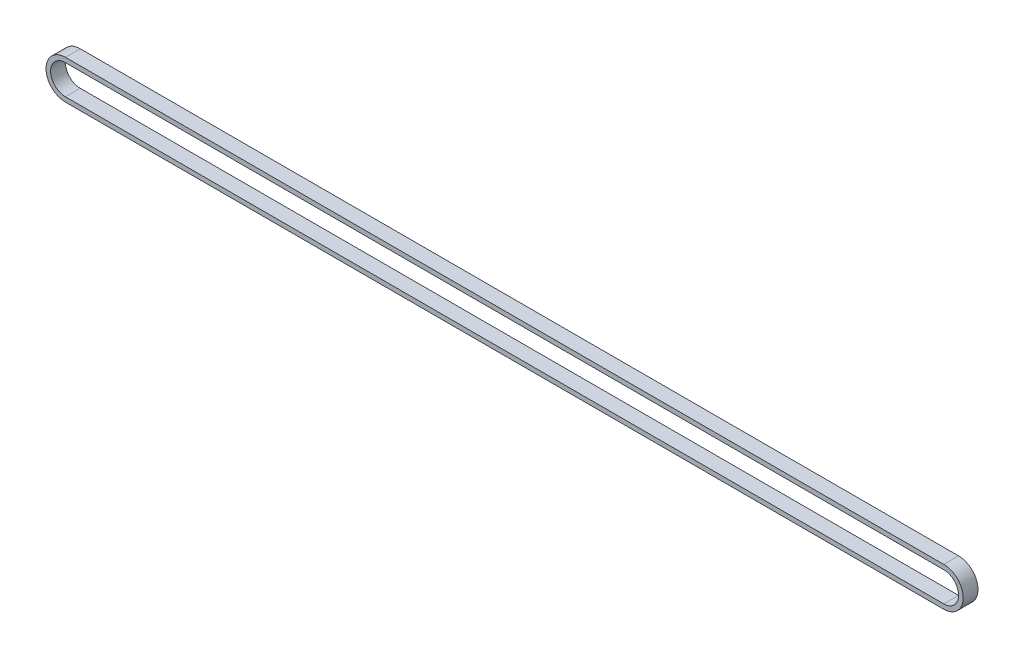
ISO-10303-21;
HEADER;
FILE_DESCRIPTION(('STEP AP214'),'2;1');
FILE_NAME('part.step','',(''),(''),'','','');
FILE_SCHEMA(('AUTOMOTIVE_DESIGN { 1 0 10303 214 1 1 1 1 }'));
ENDSEC;
DATA;
#1=APPLICATION_CONTEXT('core data for automotive mechanical design processes');
#2=APPLICATION_PROTOCOL_DEFINITION('international standard','automotive_design',2000,#1);
#3=PRODUCT_CONTEXT('',#1,'mechanical');
#4=PRODUCT('Part','Part','',(#3));
#5=PRODUCT_RELATED_PRODUCT_CATEGORY('part','',(#4));
#6=PRODUCT_DEFINITION_FORMATION('','',#4);
#7=PRODUCT_DEFINITION_CONTEXT('part definition',#1,'design');
#8=PRODUCT_DEFINITION('design','',#6,#7);
#9=PRODUCT_DEFINITION_SHAPE('','',#8);
#10=(LENGTH_UNIT() NAMED_UNIT(*) SI_UNIT(.MILLI.,.METRE.));
#11=(NAMED_UNIT(*) PLANE_ANGLE_UNIT() SI_UNIT($,.RADIAN.));
#12=(NAMED_UNIT(*) SI_UNIT($,.STERADIAN.) SOLID_ANGLE_UNIT());
#13=UNCERTAINTY_MEASURE_WITH_UNIT(LENGTH_MEASURE(1.E-05),#10,'distance_accuracy_value','');
#14=(GEOMETRIC_REPRESENTATION_CONTEXT(3) GLOBAL_UNCERTAINTY_ASSIGNED_CONTEXT((#13)) GLOBAL_UNIT_ASSIGNED_CONTEXT((#10,
#11,#12)) REPRESENTATION_CONTEXT('',''));
#15=CARTESIAN_POINT('',(0.,0.,0.));
#16=DIRECTION('',(0.,0.,1.));
#17=DIRECTION('',(1.,0.,0.));
#18=AXIS2_PLACEMENT_3D('',#15,#16,#17);
#19=CARTESIAN_POINT('',(950.,0.,8.));
#20=DIRECTION('',(0.,0.,1.));
#21=DIRECTION('',(1.,0.,0.));
#22=AXIS2_PLACEMENT_3D('',#19,#20,#21);
#23=PLANE('',#22);
#24=CARTESIAN_POINT('',(950.,0.,8.));
#25=DIRECTION('',(0.,0.,1.));
#26=DIRECTION('',(1.,0.,0.));
#27=AXIS2_PLACEMENT_3D('',#24,#25,#26);
#28=CIRCLE('',#27,20.9999999999999);
#29=CARTESIAN_POINT('',(950.,-20.9999999999999,8.));
#30=VERTEX_POINT('',#29);
#31=CARTESIAN_POINT('',(950.,20.9999999999999,8.));
#32=VERTEX_POINT('',#31);
#33=EDGE_CURVE('E138',#30,#32,#28,.T.);
#34=ORIENTED_EDGE('',*,*,#33,.T.);
#35=DIRECTION('',(-1.,0.,0.));
#36=VECTOR('',#35,1.);
#37=CARTESIAN_POINT('',(0.,21.,8.));
#38=LINE('',#37,#36);
#39=CARTESIAN_POINT('',(0.,21.,8.));
#40=VERTEX_POINT('',#39);
#41=EDGE_CURVE('E141',#32,#40,#38,.T.);
#42=ORIENTED_EDGE('',*,*,#41,.T.);
#43=CARTESIAN_POINT('',(0.,0.,8.));
#44=DIRECTION('',(0.,0.,1.));
#45=DIRECTION('',(1.,0.,0.));
#46=AXIS2_PLACEMENT_3D('',#43,#44,#45);
#47=CIRCLE('',#46,21.);
#48=CARTESIAN_POINT('',(0.,-21.,8.));
#49=VERTEX_POINT('',#48);
#50=EDGE_CURVE('E144',#40,#49,#47,.T.);
#51=ORIENTED_EDGE('',*,*,#50,.T.);
#52=DIRECTION('',(1.,0.,0.));
#53=VECTOR('',#52,1.);
#54=CARTESIAN_POINT('',(950.,-20.9999999999999,8.));
#55=LINE('',#54,#53);
#56=EDGE_CURVE('E146',#49,#30,#55,.T.);
#57=ORIENTED_EDGE('',*,*,#56,.T.);
#58=EDGE_LOOP('',(#34,#42,#51,#57));
#59=FACE_BOUND('',#58,.T.);
#60=DIRECTION('',(-1.,0.,0.));
#61=VECTOR('',#60,1.);
#62=CARTESIAN_POINT('',(0.,16.,8.));
#63=LINE('',#62,#61);
#64=CARTESIAN_POINT('',(950.,15.9999999999999,8.));
#65=VERTEX_POINT('',#64);
#66=CARTESIAN_POINT('',(0.,16.,8.));
#67=VERTEX_POINT('',#66);
#68=EDGE_CURVE('E110',#65,#67,#63,.T.);
#69=ORIENTED_EDGE('',*,*,#68,.F.);
#70=CARTESIAN_POINT('',(950.,0.,8.));
#71=DIRECTION('',(0.,0.,1.));
#72=DIRECTION('',(1.,0.,0.));
#73=AXIS2_PLACEMENT_3D('',#70,#71,#72);
#74=CIRCLE('',#73,15.9999999999999);
#75=CARTESIAN_POINT('',(950.,-15.9999999999999,8.));
#76=VERTEX_POINT('',#75);
#77=EDGE_CURVE('E102',#76,#65,#74,.T.);
#78=ORIENTED_EDGE('',*,*,#77,.F.);
#79=DIRECTION('',(1.,0.,0.));
#80=VECTOR('',#79,1.);
#81=CARTESIAN_POINT('',(950.,-15.9999999999999,8.));
#82=LINE('',#81,#80);
#83=CARTESIAN_POINT('',(0.,-16.,8.));
#84=VERTEX_POINT('',#83);
#85=EDGE_CURVE('E124',#84,#76,#82,.T.);
#86=ORIENTED_EDGE('',*,*,#85,.F.);
#87=CARTESIAN_POINT('',(0.,0.,8.));
#88=DIRECTION('',(0.,0.,1.));
#89=DIRECTION('',(1.,0.,0.));
#90=AXIS2_PLACEMENT_3D('',#87,#88,#89);
#91=CIRCLE('',#90,16.);
#92=EDGE_CURVE('E122',#67,#84,#91,.T.);
#93=ORIENTED_EDGE('',*,*,#92,.F.);
#94=EDGE_LOOP('',(#69,#78,#86,#93));
#95=FACE_BOUND('',#94,.T.);
#96=ADVANCED_FACE('F37',(#59,#95),#23,.T.);
#97=CARTESIAN_POINT('',(950.,0.,-8.));
#98=DIRECTION('',(0.,0.,1.));
#99=DIRECTION('',(1.,0.,0.));
#100=AXIS2_PLACEMENT_3D('',#97,#98,#99);
#101=PLANE('',#100);
#102=CARTESIAN_POINT('',(950.,0.,-8.));
#103=DIRECTION('',(0.,0.,1.));
#104=DIRECTION('',(1.,0.,0.));
#105=AXIS2_PLACEMENT_3D('',#102,#103,#104);
#106=CIRCLE('',#105,20.9999999999999);
#107=CARTESIAN_POINT('',(950.,-20.9999999999999,-8.));
#108=VERTEX_POINT('',#107);
#109=CARTESIAN_POINT('',(950.,20.9999999999999,-8.));
#110=VERTEX_POINT('',#109);
#111=EDGE_CURVE('E118',#108,#110,#106,.T.);
#112=ORIENTED_EDGE('',*,*,#111,.F.);
#113=DIRECTION('',(1.,0.,0.));
#114=VECTOR('',#113,1.);
#115=CARTESIAN_POINT('',(950.,-20.9999999999999,-8.));
#116=LINE('',#115,#114);
#117=CARTESIAN_POINT('',(0.,-21.,-8.));
#118=VERTEX_POINT('',#117);
#119=EDGE_CURVE('E142',#118,#108,#116,.T.);
#120=ORIENTED_EDGE('',*,*,#119,.F.);
#121=CARTESIAN_POINT('',(0.,0.,-8.));
#122=DIRECTION('',(0.,0.,1.));
#123=DIRECTION('',(1.,0.,0.));
#124=AXIS2_PLACEMENT_3D('',#121,#122,#123);
#125=CIRCLE('',#124,21.);
#126=CARTESIAN_POINT('',(0.,21.,-8.));
#127=VERTEX_POINT('',#126);
#128=EDGE_CURVE('E153',#127,#118,#125,.T.);
#129=ORIENTED_EDGE('',*,*,#128,.F.);
#130=DIRECTION('',(-1.,0.,0.));
#131=VECTOR('',#130,1.);
#132=CARTESIAN_POINT('',(0.,21.,-8.));
#133=LINE('',#132,#131);
#134=EDGE_CURVE('E151',#110,#127,#133,.T.);
#135=ORIENTED_EDGE('',*,*,#134,.F.);
#136=EDGE_LOOP('',(#112,#120,#129,#135));
#137=FACE_BOUND('',#136,.T.);
#138=CARTESIAN_POINT('',(950.,0.,-8.));
#139=DIRECTION('',(0.,0.,1.));
#140=DIRECTION('',(1.,0.,0.));
#141=AXIS2_PLACEMENT_3D('',#138,#139,#140);
#142=CIRCLE('',#141,15.9999999999999);
#143=CARTESIAN_POINT('',(950.,-15.9999999999999,-8.));
#144=VERTEX_POINT('',#143);
#145=CARTESIAN_POINT('',(950.,15.9999999999999,-8.));
#146=VERTEX_POINT('',#145);
#147=EDGE_CURVE('E60',#144,#146,#142,.T.);
#148=ORIENTED_EDGE('',*,*,#147,.T.);
#149=DIRECTION('',(-1.,0.,0.));
#150=VECTOR('',#149,1.);
#151=CARTESIAN_POINT('',(0.,16.,-8.));
#152=LINE('',#151,#150);
#153=CARTESIAN_POINT('',(0.,16.,-8.));
#154=VERTEX_POINT('',#153);
#155=EDGE_CURVE('E117',#146,#154,#152,.T.);
#156=ORIENTED_EDGE('',*,*,#155,.T.);
#157=CARTESIAN_POINT('',(0.,0.,-8.));
#158=DIRECTION('',(0.,0.,1.));
#159=DIRECTION('',(1.,0.,0.));
#160=AXIS2_PLACEMENT_3D('',#157,#158,#159);
#161=CIRCLE('',#160,16.);
#162=CARTESIAN_POINT('',(0.,-16.,-8.));
#163=VERTEX_POINT('',#162);
#164=EDGE_CURVE('E130',#154,#163,#161,.T.);
#165=ORIENTED_EDGE('',*,*,#164,.T.);
#166=DIRECTION('',(1.,0.,0.));
#167=VECTOR('',#166,1.);
#168=CARTESIAN_POINT('',(950.,-15.9999999999999,-8.));
#169=LINE('',#168,#167);
#170=EDGE_CURVE('E111',#163,#144,#169,.T.);
#171=ORIENTED_EDGE('',*,*,#170,.T.);
#172=EDGE_LOOP('',(#148,#156,#165,#171));
#173=FACE_BOUND('',#172,.T.);
#174=ADVANCED_FACE('F171',(#137,#173),#101,.F.);
#175=CARTESIAN_POINT('',(950.,0.,8.));
#176=DIRECTION('',(0.,0.,-1.));
#177=DIRECTION('',(-1.,0.,0.));
#178=AXIS2_PLACEMENT_3D('',#175,#176,#177);
#179=CYLINDRICAL_SURFACE('',#178,20.9999999999999);
#180=ORIENTED_EDGE('',*,*,#111,.T.);
#181=DIRECTION('',(0.,0.,-1.));
#182=VECTOR('',#181,1.);
#183=CARTESIAN_POINT('',(950.,20.9999999999999,8.));
#184=LINE('',#183,#182);
#185=EDGE_CURVE('E11',#32,#110,#184,.T.);
#186=ORIENTED_EDGE('',*,*,#185,.F.);
#187=ORIENTED_EDGE('',*,*,#33,.F.);
#188=DIRECTION('',(0.,0.,-1.));
#189=VECTOR('',#188,1.);
#190=CARTESIAN_POINT('',(950.,-20.9999999999999,8.));
#191=LINE('',#190,#189);
#192=EDGE_CURVE('E148',#30,#108,#191,.T.);
#193=ORIENTED_EDGE('',*,*,#192,.T.);
#194=EDGE_LOOP('',(#180,#186,#187,#193));
#195=FACE_BOUND('',#194,.T.);
#196=ADVANCED_FACE('F39',(#195),#179,.T.);
#197=CARTESIAN_POINT('',(0.,21.,8.));
#198=DIRECTION('',(0.,-1.,0.));
#199=DIRECTION('',(1.,0.,0.));
#200=AXIS2_PLACEMENT_3D('',#197,#198,#199);
#201=PLANE('',#200);
#202=ORIENTED_EDGE('',*,*,#134,.T.);
#203=DIRECTION('',(0.,0.,-1.));
#204=VECTOR('',#203,1.);
#205=CARTESIAN_POINT('',(0.,21.,8.));
#206=LINE('',#205,#204);
#207=EDGE_CURVE('E45',#40,#127,#206,.T.);
#208=ORIENTED_EDGE('',*,*,#207,.F.);
#209=ORIENTED_EDGE('',*,*,#41,.F.);
#210=ORIENTED_EDGE('',*,*,#185,.T.);
#211=EDGE_LOOP('',(#202,#208,#209,#210));
#212=FACE_BOUND('',#211,.T.);
#213=ADVANCED_FACE('F181',(#212),#201,.F.);
#214=CARTESIAN_POINT('',(0.,0.,8.));
#215=DIRECTION('',(0.,0.,-1.));
#216=DIRECTION('',(-1.,0.,0.));
#217=AXIS2_PLACEMENT_3D('',#214,#215,#216);
#218=CYLINDRICAL_SURFACE('',#217,21.);
#219=ORIENTED_EDGE('',*,*,#128,.T.);
#220=DIRECTION('',(0.,0.,-1.));
#221=VECTOR('',#220,1.);
#222=CARTESIAN_POINT('',(0.,-21.,8.));
#223=LINE('',#222,#221);
#224=EDGE_CURVE('E158',#49,#118,#223,.T.);
#225=ORIENTED_EDGE('',*,*,#224,.F.);
#226=ORIENTED_EDGE('',*,*,#50,.F.);
#227=ORIENTED_EDGE('',*,*,#207,.T.);
#228=EDGE_LOOP('',(#219,#225,#226,#227));
#229=FACE_BOUND('',#228,.T.);
#230=ADVANCED_FACE('F165',(#229),#218,.T.);
#231=CARTESIAN_POINT('',(950.,-20.9999999999999,8.));
#232=DIRECTION('',(0.,1.,0.));
#233=DIRECTION('',(-1.,0.,0.));
#234=AXIS2_PLACEMENT_3D('',#231,#232,#233);
#235=PLANE('',#234);
#236=ORIENTED_EDGE('',*,*,#119,.T.);
#237=ORIENTED_EDGE('',*,*,#192,.F.);
#238=ORIENTED_EDGE('',*,*,#56,.F.);
#239=ORIENTED_EDGE('',*,*,#224,.T.);
#240=EDGE_LOOP('',(#236,#237,#238,#239));
#241=FACE_BOUND('',#240,.T.);
#242=ADVANCED_FACE('F175',(#241),#235,.F.);
#243=CARTESIAN_POINT('',(950.,0.,8.));
#244=DIRECTION('',(0.,0.,-1.));
#245=DIRECTION('',(-1.,0.,0.));
#246=AXIS2_PLACEMENT_3D('',#243,#244,#245);
#247=CYLINDRICAL_SURFACE('',#246,15.9999999999999);
#248=ORIENTED_EDGE('',*,*,#147,.F.);
#249=DIRECTION('',(0.,0.,-1.));
#250=VECTOR('',#249,1.);
#251=CARTESIAN_POINT('',(950.,-15.9999999999999,8.));
#252=LINE('',#251,#250);
#253=EDGE_CURVE('E106',#76,#144,#252,.T.);
#254=ORIENTED_EDGE('',*,*,#253,.F.);
#255=ORIENTED_EDGE('',*,*,#77,.T.);
#256=DIRECTION('',(0.,0.,-1.));
#257=VECTOR('',#256,1.);
#258=CARTESIAN_POINT('',(950.,15.9999999999999,8.));
#259=LINE('',#258,#257);
#260=EDGE_CURVE('E105',#65,#146,#259,.T.);
#261=ORIENTED_EDGE('',*,*,#260,.T.);
#262=EDGE_LOOP('',(#248,#254,#255,#261));
#263=FACE_BOUND('',#262,.T.);
#264=ADVANCED_FACE('F104',(#263),#247,.F.);
#265=CARTESIAN_POINT('',(0.,16.,8.));
#266=DIRECTION('',(0.,-1.,0.));
#267=DIRECTION('',(1.,0.,0.));
#268=AXIS2_PLACEMENT_3D('',#265,#266,#267);
#269=PLANE('',#268);
#270=ORIENTED_EDGE('',*,*,#155,.F.);
#271=ORIENTED_EDGE('',*,*,#260,.F.);
#272=ORIENTED_EDGE('',*,*,#68,.T.);
#273=DIRECTION('',(0.,0.,-1.));
#274=VECTOR('',#273,1.);
#275=CARTESIAN_POINT('',(0.,16.,8.));
#276=LINE('',#275,#274);
#277=EDGE_CURVE('E119',#67,#154,#276,.T.);
#278=ORIENTED_EDGE('',*,*,#277,.T.);
#279=EDGE_LOOP('',(#270,#271,#272,#278));
#280=FACE_BOUND('',#279,.T.);
#281=ADVANCED_FACE('F114',(#280),#269,.T.);
#282=CARTESIAN_POINT('',(0.,0.,8.));
#283=DIRECTION('',(0.,0.,-1.));
#284=DIRECTION('',(-1.,0.,0.));
#285=AXIS2_PLACEMENT_3D('',#282,#283,#284);
#286=CYLINDRICAL_SURFACE('',#285,16.);
#287=ORIENTED_EDGE('',*,*,#164,.F.);
#288=ORIENTED_EDGE('',*,*,#277,.F.);
#289=ORIENTED_EDGE('',*,*,#92,.T.);
#290=DIRECTION('',(0.,0.,-1.));
#291=VECTOR('',#290,1.);
#292=CARTESIAN_POINT('',(0.,-16.,8.));
#293=LINE('',#292,#291);
#294=EDGE_CURVE('E52',#84,#163,#293,.T.);
#295=ORIENTED_EDGE('',*,*,#294,.T.);
#296=EDGE_LOOP('',(#287,#288,#289,#295));
#297=FACE_BOUND('',#296,.T.);
#298=ADVANCED_FACE('F204',(#297),#286,.F.);
#299=CARTESIAN_POINT('',(950.,-15.9999999999999,8.));
#300=DIRECTION('',(0.,1.,0.));
#301=DIRECTION('',(-1.,0.,0.));
#302=AXIS2_PLACEMENT_3D('',#299,#300,#301);
#303=PLANE('',#302);
#304=ORIENTED_EDGE('',*,*,#170,.F.);
#305=ORIENTED_EDGE('',*,*,#294,.F.);
#306=ORIENTED_EDGE('',*,*,#85,.T.);
#307=ORIENTED_EDGE('',*,*,#253,.T.);
#308=EDGE_LOOP('',(#304,#305,#306,#307));
#309=FACE_BOUND('',#308,.T.);
#310=ADVANCED_FACE('F208',(#309),#303,.T.);
#311=CLOSED_SHELL('',(#96,#174,#196,#213,#230,#242,#264,#281,#298,#310));
#312=MANIFOLD_SOLID_BREP('B2',#311);
#313=ADVANCED_BREP_SHAPE_REPRESENTATION('',(#18,#312),#14);
#314=SHAPE_DEFINITION_REPRESENTATION(#9,#313);
ENDSEC;
END-ISO-10303-21;
